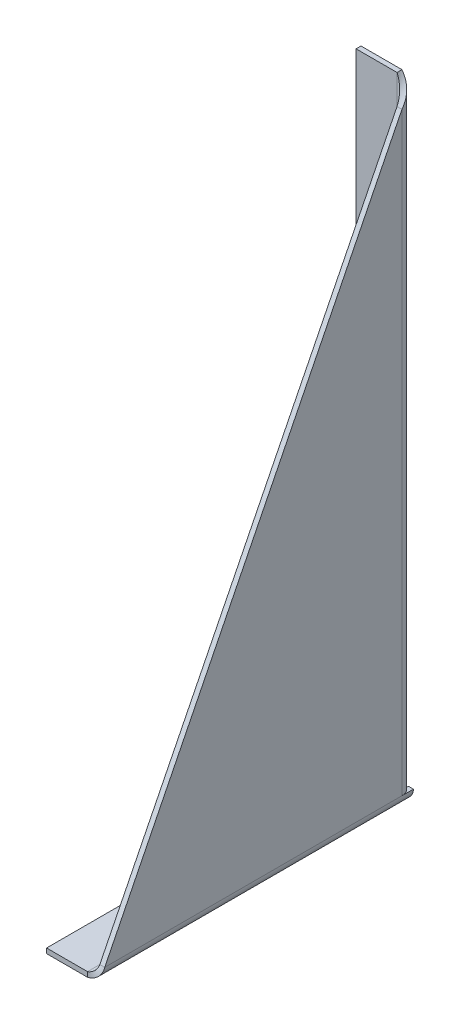
ISO-10303-21;
HEADER;
FILE_DESCRIPTION(('STEP AP214'),'2;1');
FILE_NAME('part.step','',(''),(''),'','','');
FILE_SCHEMA(('AUTOMOTIVE_DESIGN { 1 0 10303 214 1 1 1 1 }'));
ENDSEC;
DATA;
#1=APPLICATION_CONTEXT('core data for automotive mechanical design processes');
#2=APPLICATION_PROTOCOL_DEFINITION('international standard','automotive_design',2000,#1);
#3=PRODUCT_CONTEXT('',#1,'mechanical');
#4=PRODUCT('Part','Part','',(#3));
#5=PRODUCT_RELATED_PRODUCT_CATEGORY('part','',(#4));
#6=PRODUCT_DEFINITION_FORMATION('','',#4);
#7=PRODUCT_DEFINITION_CONTEXT('part definition',#1,'design');
#8=PRODUCT_DEFINITION('design','',#6,#7);
#9=PRODUCT_DEFINITION_SHAPE('','',#8);
#10=(LENGTH_UNIT() NAMED_UNIT(*) SI_UNIT(.MILLI.,.METRE.));
#11=(NAMED_UNIT(*) PLANE_ANGLE_UNIT() SI_UNIT($,.RADIAN.));
#12=(NAMED_UNIT(*) SI_UNIT($,.STERADIAN.) SOLID_ANGLE_UNIT());
#13=UNCERTAINTY_MEASURE_WITH_UNIT(LENGTH_MEASURE(1.E-05),#10,'distance_accuracy_value','');
#14=(GEOMETRIC_REPRESENTATION_CONTEXT(3) GLOBAL_UNCERTAINTY_ASSIGNED_CONTEXT((#13)) GLOBAL_UNIT_ASSIGNED_CONTEXT((#10,
#11,#12)) REPRESENTATION_CONTEXT('',''));
#15=CARTESIAN_POINT('',(0.,0.,0.));
#16=DIRECTION('',(0.,0.,1.));
#17=DIRECTION('',(1.,0.,0.));
#18=AXIS2_PLACEMENT_3D('',#15,#16,#17);
#19=CARTESIAN_POINT('',(-2.38125,5.55624999999999,0.));
#20=DIRECTION('',(0.,1.,0.));
#21=DIRECTION('',(0.,0.,1.));
#22=AXIS2_PLACEMENT_3D('',#19,#20,#21);
#23=PLANE('',#22);
#24=DIRECTION('',(0.,0.,1.));
#25=VECTOR('',#24,1.);
#26=CARTESIAN_POINT('',(-2.38125,5.55624999999999,0.));
#27=LINE('',#26,#25);
#28=CARTESIAN_POINT('',(-2.38125,5.55624999999999,0.));
#29=VERTEX_POINT('',#28);
#30=CARTESIAN_POINT('',(-2.38125,5.55624999999999,0.996503399310422));
#31=VERTEX_POINT('',#30);
#32=EDGE_CURVE('E582',#29,#31,#27,.T.);
#33=ORIENTED_EDGE('',*,*,#32,.T.);
#34=CARTESIAN_POINT('',(-5.55624999999999,5.55624999999999,5.55624999999999));
#35=DIRECTION('',(0.,-1.,0.));
#36=DIRECTION('',(0.,0.,-1.));
#37=AXIS2_PLACEMENT_3D('',#34,#35,#36);
#38=CIRCLE('',#37,5.55625);
#39=CARTESIAN_POINT('',(0.,5.55624999999999,5.55624999999998));
#40=VERTEX_POINT('',#39);
#41=EDGE_CURVE('E13',#31,#40,#38,.T.);
#42=ORIENTED_EDGE('',*,*,#41,.T.);
#43=DIRECTION('',(0.,0.,1.));
#44=VECTOR('',#43,1.);
#45=CARTESIAN_POINT('',(0.,5.55624999999994,152.4));
#46=LINE('',#45,#44);
#47=CARTESIAN_POINT('',(0.,5.55624999999999,0.));
#48=VERTEX_POINT('',#47);
#49=EDGE_CURVE('E556',#48,#40,#46,.T.);
#50=ORIENTED_EDGE('',*,*,#49,.F.);
#51=DIRECTION('',(1.,0.,0.));
#52=VECTOR('',#51,1.);
#53=CARTESIAN_POINT('',(-2.38125,5.55624999999999,0.));
#54=LINE('',#53,#52);
#55=EDGE_CURVE('E125',#29,#48,#54,.T.);
#56=ORIENTED_EDGE('',*,*,#55,.F.);
#57=EDGE_LOOP('',(#33,#42,#50,#56));
#58=FACE_BOUND('',#57,.T.);
#59=ADVANCED_FACE('F77',(#58),#23,.T.);
#60=CARTESIAN_POINT('',(-2.38125,304.8,0.));
#61=DIRECTION('',(0.,0.447213595499958,0.894427190999916));
#62=DIRECTION('',(0.,-0.894427190999916,0.447213595499958));
#63=AXIS2_PLACEMENT_3D('',#60,#61,#62);
#64=PLANE('',#63);
#65=DIRECTION('',(0.,-0.894427190999916,0.447213595499958));
#66=VECTOR('',#65,1.);
#67=CARTESIAN_POINT('',(0.,304.8,0.));
#68=LINE('',#67,#66);
#69=CARTESIAN_POINT('',(0.,293.6875,5.55624999999999));
#70=VERTEX_POINT('',#69);
#71=CARTESIAN_POINT('',(0.,5.55624999999999,149.621875));
#72=VERTEX_POINT('',#71);
#73=EDGE_CURVE('E81',#70,#72,#68,.T.);
#74=ORIENTED_EDGE('',*,*,#73,.F.);
#75=DIRECTION('',(1.,0.,0.));
#76=VECTOR('',#75,1.);
#77=CARTESIAN_POINT('',(-2.38124999999999,293.6875,5.55624999999999));
#78=LINE('',#77,#76);
#79=CARTESIAN_POINT('',(-2.38124999999999,293.6875,5.55624999999999));
#80=VERTEX_POINT('',#79);
#81=EDGE_CURVE('E231',#80,#70,#78,.T.);
#82=ORIENTED_EDGE('',*,*,#81,.F.);
#83=DIRECTION('',(0.,-0.894427190999916,0.447213595499958));
#84=VECTOR('',#83,1.);
#85=CARTESIAN_POINT('',(-2.38125,304.8,0.));
#86=LINE('',#85,#84);
#87=CARTESIAN_POINT('',(-2.38125,5.55624999999999,149.621875));
#88=VERTEX_POINT('',#87);
#89=EDGE_CURVE('E86',#80,#88,#86,.T.);
#90=ORIENTED_EDGE('',*,*,#89,.T.);
#91=DIRECTION('',(1.,0.,0.));
#92=VECTOR('',#91,1.);
#93=CARTESIAN_POINT('',(-2.38125,5.55624999999999,149.621875));
#94=LINE('',#93,#92);
#95=EDGE_CURVE('E314',#88,#72,#94,.T.);
#96=ORIENTED_EDGE('',*,*,#95,.T.);
#97=EDGE_LOOP('',(#74,#82,#90,#96));
#98=FACE_BOUND('',#97,.T.);
#99=ADVANCED_FACE('F79',(#98),#64,.T.);
#100=CARTESIAN_POINT('',(-2.38125,0.,0.));
#101=DIRECTION('',(1.,0.,0.));
#102=DIRECTION('',(0.,0.,-1.));
#103=AXIS2_PLACEMENT_3D('',#100,#101,#102);
#104=PLANE('',#103);
#105=DIRECTION('',(0.,-1.,0.));
#106=VECTOR('',#105,1.);
#107=CARTESIAN_POINT('',(-2.38124999999999,5.55625000000004,5.55624999999999));
#108=LINE('',#107,#106);
#109=CARTESIAN_POINT('',(-2.38124999999999,5.55624999999999,5.55624999999999));
#110=VERTEX_POINT('',#109);
#111=EDGE_CURVE('E226',#110,#80,#108,.F.);
#112=ORIENTED_EDGE('',*,*,#111,.F.);
#113=DIRECTION('',(0.,0.,1.));
#114=VECTOR('',#113,1.);
#115=CARTESIAN_POINT('',(-2.38125,5.55624999999999,152.4));
#116=LINE('',#115,#114);
#117=EDGE_CURVE('E352',#88,#110,#116,.F.);
#118=ORIENTED_EDGE('',*,*,#117,.F.);
#119=ORIENTED_EDGE('',*,*,#89,.F.);
#120=EDGE_LOOP('',(#112,#118,#119));
#121=FACE_BOUND('',#120,.T.);
#122=ADVANCED_FACE('F272',(#121),#104,.F.);
#123=CARTESIAN_POINT('',(0.,0.,0.));
#124=DIRECTION('',(1.,0.,0.));
#125=DIRECTION('',(0.,0.,-1.));
#126=AXIS2_PLACEMENT_3D('',#123,#124,#125);
#127=PLANE('',#126);
#128=DIRECTION('',(0.,0.,1.));
#129=VECTOR('',#128,1.);
#130=CARTESIAN_POINT('',(0.,5.55624999999999,152.4));
#131=LINE('',#130,#129);
#132=EDGE_CURVE('E312',#72,#40,#131,.F.);
#133=ORIENTED_EDGE('',*,*,#132,.T.);
#134=DIRECTION('',(0.,-1.,0.));
#135=VECTOR('',#134,1.);
#136=CARTESIAN_POINT('',(0.,5.55625000000004,5.55624999999999));
#137=LINE('',#136,#135);
#138=EDGE_CURVE('E221',#40,#70,#137,.F.);
#139=ORIENTED_EDGE('',*,*,#138,.T.);
#140=ORIENTED_EDGE('',*,*,#73,.T.);
#141=EDGE_LOOP('',(#133,#139,#140));
#142=FACE_BOUND('',#141,.T.);
#143=ADVANCED_FACE('F334',(#142),#127,.T.);
#144=CARTESIAN_POINT('',(-5.55625,5.55624999999999,0.));
#145=DIRECTION('',(0.,0.,-1.));
#146=DIRECTION('',(-1.,0.,0.));
#147=AXIS2_PLACEMENT_3D('',#144,#145,#146);
#148=PLANE('',#147);
#149=DIRECTION('',(0.,1.,0.));
#150=VECTOR('',#149,1.);
#151=CARTESIAN_POINT('',(-5.55624999999998,0.,0.));
#152=LINE('',#151,#150);
#153=CARTESIAN_POINT('',(-5.55624999999999,2.38124999999999,0.));
#154=VERTEX_POINT('',#153);
#155=CARTESIAN_POINT('',(-5.55624999999998,0.,0.));
#156=VERTEX_POINT('',#155);
#157=EDGE_CURVE('E553',#154,#156,#152,.F.);
#158=ORIENTED_EDGE('',*,*,#157,.F.);
#159=CARTESIAN_POINT('',(-5.55625,5.55624999999999,0.));
#160=DIRECTION('',(0.,0.,1.));
#161=DIRECTION('',(1.,0.,0.));
#162=AXIS2_PLACEMENT_3D('',#159,#160,#161);
#163=CIRCLE('',#162,3.175);
#164=EDGE_CURVE('E313',#29,#154,#163,.F.);
#165=ORIENTED_EDGE('',*,*,#164,.F.);
#166=ORIENTED_EDGE('',*,*,#55,.T.);
#167=CARTESIAN_POINT('',(-5.55625,5.55624999999999,0.));
#168=DIRECTION('',(0.,0.,1.));
#169=DIRECTION('',(1.,0.,0.));
#170=AXIS2_PLACEMENT_3D('',#167,#168,#169);
#171=CIRCLE('',#170,5.55625);
#172=EDGE_CURVE('E343',#48,#156,#171,.F.);
#173=ORIENTED_EDGE('',*,*,#172,.T.);
#174=EDGE_LOOP('',(#158,#165,#166,#173));
#175=FACE_BOUND('',#174,.T.);
#176=ADVANCED_FACE('F325',(#175),#148,.T.);
#177=CARTESIAN_POINT('',(-5.55624999999998,-0.0238125000000113,152.4));
#178=CARTESIAN_POINT('',(-4.82570183986023,-0.0238125000000087,152.16845162232));
#179=CARTESIAN_POINT('',(-4.09568044603243,0.121421590898501,151.936979166667));
#180=CARTESIAN_POINT('',(-2.7460246133441,0.680467341333964,151.473958333333));
#181=CARTESIAN_POINT('',(-2.12704089336997,1.0940590402405,151.242447916667));
#182=CARTESIAN_POINT('',(-1.0940590402405,2.12704089336997,150.779427083333));
#183=CARTESIAN_POINT('',(-0.680467341333966,2.7460246133441,150.547916666667));
#184=CARTESIAN_POINT('',(-0.121421590898507,4.09568044603244,150.084895833333));
#185=CARTESIAN_POINT('',(0.0238124999999992,4.82570183986026,149.85342337768));
#186=CARTESIAN_POINT('',(0.0238124999999991,5.55624999999999,149.621875));
#187=CARTESIAN_POINT('',(-5.55624999999998,0.,152.4));
#188=CARTESIAN_POINT('',(-4.82881950762639,0.,152.168451682766));
#189=CARTESIAN_POINT('',(-4.10191331752873,0.144614315261665,151.936979166667));
#190=CARTESIAN_POINT('',(-2.75801704031418,0.70127437970665,151.473958333333));
#191=CARTESIAN_POINT('',(-2.14167478713937,1.11310110692511,151.242447916667));
#192=CARTESIAN_POINT('',(-1.11310110692511,2.14167478713937,150.779427083333));
#193=CARTESIAN_POINT('',(-0.701274379706652,2.75801704031419,150.547916666667));
#194=CARTESIAN_POINT('',(-0.144614315261671,4.10191331752874,150.084895833333));
#195=CARTESIAN_POINT('',(0.,4.82881950762642,149.853423317234));
#196=CARTESIAN_POINT('',(0.,5.55624999999999,149.621875));
#197=CARTESIAN_POINT('',(-5.55624999999999,2.38124999999999,152.4));
#198=CARTESIAN_POINT('',(-5.14058628424239,2.38124999999999,152.168457727406));
#199=CARTESIAN_POINT('',(-4.72520046715928,2.46388675157809,151.936979166667));
#200=CARTESIAN_POINT('',(-3.95725973732239,2.78197821697522,151.473958333333));
#201=CARTESIAN_POINT('',(-3.60506416407964,3.01730777538577,151.242447916667));
#202=CARTESIAN_POINT('',(-3.01730777538578,3.60506416407964,150.779427083333));
#203=CARTESIAN_POINT('',(-2.78197821697523,3.95725973732239,150.547916666667));
#204=CARTESIAN_POINT('',(-2.4638867515781,4.72520046715928,150.084895833333));
#205=CARTESIAN_POINT('',(-2.38125,5.14058628424239,149.853417272594));
#206=CARTESIAN_POINT('',(-2.38125,5.55624999999999,149.621875));
#207=CARTESIAN_POINT('',(-5.55624999999999,2.40530062499999,152.4));
#208=CARTESIAN_POINT('',(-5.14373512868621,2.40530062499999,152.168457788457));
#209=CARTESIAN_POINT('',(-4.73149566737054,2.48731140318489,151.936979166667));
#210=CARTESIAN_POINT('',(-3.96937208856217,2.80299332573164,151.473958333333));
#211=CARTESIAN_POINT('',(-3.61984439678674,3.03654026273722,151.242447916667));
#212=CARTESIAN_POINT('',(-3.03654026273723,3.61984439678673,150.779427083333));
#213=CARTESIAN_POINT('',(-2.80299332573164,3.96937208856217,150.547916666667));
#214=CARTESIAN_POINT('',(-2.48731140318489,4.73149566737054,150.084895833333));
#215=CARTESIAN_POINT('',(-2.405300625,5.14373512868621,149.853417211543));
#216=CARTESIAN_POINT('',(-2.405300625,5.55624999999999,149.621875));
#217=B_SPLINE_SURFACE_WITH_KNOTS('',1,3,((#177,#178,#179,#180,#181,#182,#183,#184,#185,#186),
(#187,#188,#189,#190,#191,#192,#193,#194,#195,#196),(#197,#198,#199,#200,#201,#202,#203,#204,
#205,#206),(#207,#208,#209,#210,#211,#212,#213,#214,#215,#216)),.UNSPECIFIED.,.F.,.F.,.F.,(2,1,
1,2),(4,2,2,2,4),(-0.01,0.,1.,1.0101),(0.,0.25,0.5,0.75,1.),.UNSPECIFIED.);
#218=CARTESIAN_POINT('',(-5.55624999999999,2.38124999999999,152.4));
#219=CARTESIAN_POINT('',(-5.46666090109255,2.38124041505701,152.350093108591));
#220=CARTESIAN_POINT('',(-5.37707317596189,2.38504154666799,152.300187019629));
#221=CARTESIAN_POINT('',(-5.19854934759974,2.40019501803075,152.200383057935));
#222=CARTESIAN_POINT('',(-5.10961316039504,2.41154636672773,152.150485184984));
#223=CARTESIAN_POINT('',(-4.93300019826956,2.44173302703924,152.050681428032));
#224=CARTESIAN_POINT('',(-4.84532367256282,2.46056979902164,152.000775544369));
#225=CARTESIAN_POINT('',(-4.67187352948099,2.50558909566138,151.900957294849));
#226=CARTESIAN_POINT('',(-4.5861000867557,2.53177229153079,151.851044928818));
#227=CARTESIAN_POINT('',(-4.4051541669731,2.59549794133177,151.744179496098));
#228=CARTESIAN_POINT('',(-4.31036076808948,2.63412125508188,151.687225560889));
#229=CARTESIAN_POINT('',(-4.12490619430006,2.72034754794941,151.573295917417));
#230=CARTESIAN_POINT('',(-4.034246744803,2.76795423467264,151.516320209891));
#231=CARTESIAN_POINT('',(-3.85798574110667,2.87166926914977,151.402401399609));
#232=CARTESIAN_POINT('',(-3.77238168139095,2.92777335549043,151.34545829479));
#233=CARTESIAN_POINT('',(-3.60695658974449,3.04799582542632,151.231548569969));
#234=CARTESIAN_POINT('',(-3.52713758837848,3.11211700171843,151.174581948701));
#235=CARTESIAN_POINT('',(-3.37407081790601,3.24774971629631,151.060657022631));
#236=CARTESIAN_POINT('',(-3.30082199173982,3.31926006175794,151.00369871797));
#237=CARTESIAN_POINT('',(-3.16156399941344,3.46901287381441,150.889781868224));
#238=CARTESIAN_POINT('',(-3.09555483501599,3.5472553420484,150.832823323139));
#239=CARTESIAN_POINT('',(-2.97134380762172,3.70980603854188,150.718868198181));
#240=CARTESIAN_POINT('',(-2.9131478361482,3.79411877129527,150.661871621815));
#241=CARTESIAN_POINT('',(-2.80518666684653,3.96793669222064,150.54789498402));
#242=CARTESIAN_POINT('',(-2.75541854635122,4.05744006583254,150.490914923735));
#243=CARTESIAN_POINT('',(-2.66470191537867,4.24093214650852,150.376890774375));
#244=CARTESIAN_POINT('',(-2.62376320210969,4.33492569614883,150.319846684058));
#245=CARTESIAN_POINT('',(-2.55117146613664,4.5263928511216,150.205779208101));
#246=CARTESIAN_POINT('',(-2.51951492959808,4.62386512384344,150.148755822808));
#247=CARTESIAN_POINT('',(-2.46580460035651,4.82125384358962,150.03480573941));
#248=CARTESIAN_POINT('',(-2.44373579794904,4.92116620969384,149.977879030162));
#249=CARTESIAN_POINT('',(-2.40934502280359,5.12260952873571,149.864047509933));
#250=CARTESIAN_POINT('',(-2.39701731986159,5.22413949420387,149.807142705788));
#251=CARTESIAN_POINT('',(-2.38682250016021,5.36432870000405,149.728842927781));
#252=CARTESIAN_POINT('',(-2.38473176178235,5.40270865342091,149.707434552135));
#253=CARTESIAN_POINT('',(-2.38194646086697,5.47947422950968,149.664643117532));
#254=CARTESIAN_POINT('',(-2.38125026352045,5.51785979272543,149.643260058333));
#255=CARTESIAN_POINT('',(-2.38125,5.55624999999999,149.621875));
#256=B_SPLINE_CURVE_WITH_KNOTS('',3,(#218,#219,#220,#221,#222,#223,#224,#225,#226,#227,#228,
#229,#230,#231,#232,#233,#234,#235,#236,#237,#238,#239,#240,#241,#242,#243,#244,#245,#246,#247,
#248,#249,#250,#251,#252,#253,#254,#255),.UNSPECIFIED.,.F.,.F.,(4,2,2,2,2,2,2,2,2,2,2,2,2,2,2,2,
2,2,4),(0.,0.307582997442148,0.615125628963629,0.92272828996297,1.23035906448933,
1.58134663835237,1.93247938943538,2.28343662831411,2.63451646307504,2.98553971174556,
3.33656304588407,3.68784959944513,4.03901408089327,4.39056623615535,4.74198513650294,
5.09285188662854,5.44351208533431,5.57548514811854,5.70730340920833),.UNSPECIFIED.);
#257=CARTESIAN_POINT('',(-5.55624999999999,2.38124999999999,152.4));
#258=VERTEX_POINT('',#257);
#259=EDGE_CURVE('E316',#258,#88,#256,.T.);
#260=DIRECTION('',(0.,1.,0.));
#261=VECTOR('',#260,1.);
#262=CARTESIAN_POINT('',(-5.55624999999999,2.38124999999999,152.4));
#263=LINE('',#262,#261);
#264=CARTESIAN_POINT('',(-5.55624999999998,0.,152.4));
#265=VERTEX_POINT('',#264);
#266=EDGE_CURVE('E558',#258,#265,#263,.F.);
#267=CARTESIAN_POINT('',(-5.55624999999998,0.,152.4));
#268=CARTESIAN_POINT('',(-5.39222924973911,-2.03697111468316E-05,152.347788331812));
#269=CARTESIAN_POINT('',(-5.22821120137321,0.00726199032458196,152.295577783836));
#270=CARTESIAN_POINT('',(-4.90146692582221,0.036285149405175,152.191161704353));
#271=CARTESIAN_POINT('',(-4.73874063051544,0.0580251808177364,152.138956172727));
#272=CARTESIAN_POINT('',(-4.41597567927968,0.115793944747649,152.034588452675));
#273=CARTESIAN_POINT('',(-4.25593500851214,0.151811415917823,151.98242626248));
#274=CARTESIAN_POINT('',(-3.939665950031,0.237845853161354,151.878097821083));
#275=CARTESIAN_POINT('',(-3.78343751209572,0.287862634701883,151.825931569943));
#276=CARTESIAN_POINT('',(-3.47592287348703,0.4015393914794,151.721569503876));
#277=CARTESIAN_POINT('',(-3.32463957606517,0.465207221040563,151.669373689256));
#278=CARTESIAN_POINT('',(-3.02824038249729,0.605695629367385,151.564962647053));
#279=CARTESIAN_POINT('',(-2.88312677774738,0.682521042446689,151.512747419398));
#280=CARTESIAN_POINT('',(-2.60032456674858,0.848670722788835,151.408344538769));
#281=CARTESIAN_POINT('',(-2.46263273318536,0.93798949564216,151.356156883741));
#282=CARTESIAN_POINT('',(-2.19568324034633,1.12845253403165,151.251777395514));
#283=CARTESIAN_POINT('',(-2.0664257589181,1.22959704880111,151.199585562248));
#284=CARTESIAN_POINT('',(-1.81736928125491,1.44291000961841,151.095203981869));
#285=CARTESIAN_POINT('',(-1.69756958924114,1.55507764336584,151.043014234884));
#286=CARTESIAN_POINT('',(-1.46835597691733,1.7895648001765,150.938634060507));
#287=CARTESIAN_POINT('',(-1.3589420570885,1.9118843237101,150.886443633115));
#288=CARTESIAN_POINT('',(-1.15131625866794,2.1657671164626,150.782046762958));
#289=CARTESIAN_POINT('',(-1.05310867893295,2.29733390195172,150.729840321699));
#290=CARTESIAN_POINT('',(-0.868716373510253,2.56863504006366,150.625429367484));
#291=CARTESIAN_POINT('',(-0.782531395322642,2.70836922106653,150.573224854511));
#292=CARTESIAN_POINT('',(-0.622809870449583,2.99499724678851,150.468779645361));
#293=CARTESIAN_POINT('',(-0.549280975572844,3.14189535439459,150.416538946333));
#294=CARTESIAN_POINT('',(-0.415535761944639,3.44156714760269,150.312077727971));
#295=CARTESIAN_POINT('',(-0.355314521441942,3.59433863634816,150.259857208331));
#296=CARTESIAN_POINT('',(-0.248665446951269,3.90448414901306,150.155459126881));
#297=CARTESIAN_POINT('',(-0.202226588463913,4.06185438310978,150.103281564211));
#298=CARTESIAN_POINT('',(-0.123455032418098,4.38002667914916,149.998949488509));
#299=CARTESIAN_POINT('',(-0.0911167157239651,4.54082734720159,149.946794974586));
#300=CARTESIAN_POINT('',(-0.0439887266945035,4.8439855129455,149.849140766533));
#301=CARTESIAN_POINT('',(-0.0274868539155354,4.98607941179266,149.803640739908));
#302=CARTESIAN_POINT('',(-0.0054969794958962,5.27086362238831,149.712719632739));
#303=CARTESIAN_POINT('',(1.04261535497424E-05,5.41355243721639,149.667298554718));
#304=CARTESIAN_POINT('',(0.,5.55624999999999,149.621875));
#305=B_SPLINE_CURVE_WITH_KNOTS('',3,(#267,#268,#269,#270,#271,#272,#273,#274,#275,#276,#277,
#278,#279,#280,#281,#282,#283,#284,#285,#286,#287,#288,#289,#290,#291,#292,#293,#294,#295,#296,
#297,#298,#299,#300,#301,#302,#303,#304),.UNSPECIFIED.,.F.,.F.,(4,2,2,2,2,2,2,2,2,2,2,2,2,2,2,2,
2,2,4),(0.,0.516233035731352,1.03243866417777,1.54823794241121,2.06403042192279,
2.58012047016457,3.09640054681476,3.6124542802638,4.12851889175858,4.64454550261058,
5.16057213737173,5.67679606398377,6.19300914717568,6.70953324239668,7.22586598355228,
7.74178459109643,8.25749741420172,8.70743200890214,9.15657181468087),.UNSPECIFIED.);
#306=EDGE_CURVE('E304',#265,#72,#305,.T.);
#307=ORIENTED_EDGE('',*,*,#259,.F.);
#308=ORIENTED_EDGE('',*,*,#266,.T.);
#309=ORIENTED_EDGE('',*,*,#306,.T.);
#310=ORIENTED_EDGE('',*,*,#95,.F.);
#311=EDGE_LOOP('',(#307,#308,#309,#310));
#312=FACE_BOUND('',#311,.T.);
#313=ADVANCED_FACE('F299',(#312),#217,.F.);
#314=CARTESIAN_POINT('',(-5.55625,5.55624999999999,152.4));
#315=DIRECTION('',(0.,0.,1.));
#316=DIRECTION('',(0.,-1.,0.));
#317=AXIS2_PLACEMENT_3D('',#314,#315,#316);
#318=CYLINDRICAL_SURFACE('',#317,5.55625);
#319=ORIENTED_EDGE('',*,*,#132,.F.);
#320=ORIENTED_EDGE('',*,*,#306,.F.);
#321=DIRECTION('',(0.,0.,1.));
#322=VECTOR('',#321,1.);
#323=CARTESIAN_POINT('',(-5.55624999999998,0.,0.));
#324=LINE('',#323,#322);
#325=EDGE_CURVE('E561',#265,#156,#324,.F.);
#326=ORIENTED_EDGE('',*,*,#325,.T.);
#327=ORIENTED_EDGE('',*,*,#172,.F.);
#328=ORIENTED_EDGE('',*,*,#49,.T.);
#329=EDGE_LOOP('',(#319,#320,#326,#327,#328));
#330=FACE_BOUND('',#329,.T.);
#331=ADVANCED_FACE('F295',(#330),#318,.T.);
#332=CARTESIAN_POINT('',(-5.55625,5.55624999999999,152.4));
#333=DIRECTION('',(0.,0.,1.));
#334=DIRECTION('',(0.,-1.,0.));
#335=AXIS2_PLACEMENT_3D('',#332,#333,#334);
#336=CYLINDRICAL_SURFACE('',#335,3.175);
#337=ORIENTED_EDGE('',*,*,#117,.T.);
#338=EDGE_CURVE('E95',#31,#110,#27,.T.);
#339=ORIENTED_EDGE('',*,*,#338,.F.);
#340=ORIENTED_EDGE('',*,*,#32,.F.);
#341=ORIENTED_EDGE('',*,*,#164,.T.);
#342=DIRECTION('',(0.,0.,1.));
#343=VECTOR('',#342,1.);
#344=CARTESIAN_POINT('',(-5.55624999999999,2.38124999999999,0.));
#345=LINE('',#344,#343);
#346=EDGE_CURVE('E555',#154,#258,#345,.T.);
#347=ORIENTED_EDGE('',*,*,#346,.T.);
#348=ORIENTED_EDGE('',*,*,#259,.T.);
#349=EDGE_LOOP('',(#337,#339,#340,#341,#347,#348));
#350=FACE_BOUND('',#349,.T.);
#351=ADVANCED_FACE('F293',(#350),#336,.F.);
#352=CARTESIAN_POINT('',(-25.4,0.,152.4));
#353=DIRECTION('',(0.,0.,-1.));
#354=DIRECTION('',(-1.,0.,0.));
#355=AXIS2_PLACEMENT_3D('',#352,#353,#354);
#356=PLANE('',#355);
#357=ORIENTED_EDGE('',*,*,#266,.F.);
#358=DIRECTION('',(1.,0.,0.));
#359=VECTOR('',#358,1.);
#360=CARTESIAN_POINT('',(-25.4,2.38124999999992,152.4));
#361=LINE('',#360,#359);
#362=CARTESIAN_POINT('',(-25.4,2.38124999999992,152.4));
#363=VERTEX_POINT('',#362);
#364=EDGE_CURVE('E563',#258,#363,#361,.F.);
#365=ORIENTED_EDGE('',*,*,#364,.T.);
#366=DIRECTION('',(0.,1.,0.));
#367=VECTOR('',#366,1.);
#368=CARTESIAN_POINT('',(-25.4,0.,152.4));
#369=LINE('',#368,#367);
#370=CARTESIAN_POINT('',(-25.4,0.,152.4));
#371=VERTEX_POINT('',#370);
#372=EDGE_CURVE('E545',#371,#363,#369,.T.);
#373=ORIENTED_EDGE('',*,*,#372,.F.);
#374=DIRECTION('',(-1.,0.,0.));
#375=VECTOR('',#374,1.);
#376=CARTESIAN_POINT('',(0.,0.,152.4));
#377=LINE('',#376,#375);
#378=EDGE_CURVE('E570',#265,#371,#377,.T.);
#379=ORIENTED_EDGE('',*,*,#378,.F.);
#380=EDGE_LOOP('',(#357,#365,#373,#379));
#381=FACE_BOUND('',#380,.T.);
#382=ADVANCED_FACE('F286',(#381),#356,.F.);
#383=CARTESIAN_POINT('',(-2.38124999999999,0.,0.));
#384=DIRECTION('',(0.,0.,1.));
#385=DIRECTION('',(1.,0.,0.));
#386=AXIS2_PLACEMENT_3D('',#383,#384,#385);
#387=PLANE('',#386);
#388=ORIENTED_EDGE('',*,*,#157,.T.);
#389=DIRECTION('',(1.,0.,0.));
#390=VECTOR('',#389,1.);
#391=CARTESIAN_POINT('',(0.,0.,0.));
#392=LINE('',#391,#390);
#393=CARTESIAN_POINT('',(-25.4,0.,0.));
#394=VERTEX_POINT('',#393);
#395=EDGE_CURVE('E574',#394,#156,#392,.T.);
#396=ORIENTED_EDGE('',*,*,#395,.F.);
#397=DIRECTION('',(0.,1.,0.));
#398=VECTOR('',#397,1.);
#399=CARTESIAN_POINT('',(-25.4,0.,0.));
#400=LINE('',#399,#398);
#401=CARTESIAN_POINT('',(-25.4,2.38124999999992,0.));
#402=VERTEX_POINT('',#401);
#403=EDGE_CURVE('E577',#394,#402,#400,.T.);
#404=ORIENTED_EDGE('',*,*,#403,.T.);
#405=DIRECTION('',(-1.,0.,0.));
#406=VECTOR('',#405,1.);
#407=CARTESIAN_POINT('',(-2.38125,2.38125,0.));
#408=LINE('',#407,#406);
#409=EDGE_CURVE('E567',#402,#154,#408,.F.);
#410=ORIENTED_EDGE('',*,*,#409,.T.);
#411=EDGE_LOOP('',(#388,#396,#404,#410));
#412=FACE_BOUND('',#411,.T.);
#413=ADVANCED_FACE('F278',(#412),#387,.F.);
#414=CARTESIAN_POINT('',(0.,0.,0.));
#415=DIRECTION('',(0.,1.,0.));
#416=DIRECTION('',(-1.,0.,0.));
#417=AXIS2_PLACEMENT_3D('',#414,#415,#416);
#418=PLANE('',#417);
#419=ORIENTED_EDGE('',*,*,#325,.F.);
#420=ORIENTED_EDGE('',*,*,#378,.T.);
#421=DIRECTION('',(0.,0.,-1.));
#422=VECTOR('',#421,1.);
#423=CARTESIAN_POINT('',(-25.4,0.,0.));
#424=LINE('',#423,#422);
#425=EDGE_CURVE('E572',#371,#394,#424,.T.);
#426=ORIENTED_EDGE('',*,*,#425,.T.);
#427=ORIENTED_EDGE('',*,*,#395,.T.);
#428=EDGE_LOOP('',(#419,#420,#426,#427));
#429=FACE_BOUND('',#428,.T.);
#430=ADVANCED_FACE('F274',(#429),#418,.F.);
#431=CARTESIAN_POINT('',(0.,2.38125000000001,0.));
#432=DIRECTION('',(0.,1.,0.));
#433=DIRECTION('',(-1.,0.,0.));
#434=AXIS2_PLACEMENT_3D('',#431,#432,#433);
#435=PLANE('',#434);
#436=ORIENTED_EDGE('',*,*,#364,.F.);
#437=ORIENTED_EDGE('',*,*,#346,.F.);
#438=ORIENTED_EDGE('',*,*,#409,.F.);
#439=DIRECTION('',(0.,0.,1.));
#440=VECTOR('',#439,1.);
#441=CARTESIAN_POINT('',(-25.4,2.38124999999992,0.));
#442=LINE('',#441,#440);
#443=EDGE_CURVE('E565',#363,#402,#442,.F.);
#444=ORIENTED_EDGE('',*,*,#443,.F.);
#445=EDGE_LOOP('',(#436,#437,#438,#444));
#446=FACE_BOUND('',#445,.T.);
#447=ADVANCED_FACE('F277',(#446),#435,.T.);
#448=CARTESIAN_POINT('',(-25.4,0.,0.));
#449=DIRECTION('',(1.,0.,0.));
#450=DIRECTION('',(0.,1.,0.));
#451=AXIS2_PLACEMENT_3D('',#448,#449,#450);
#452=PLANE('',#451);
#453=ORIENTED_EDGE('',*,*,#443,.T.);
#454=ORIENTED_EDGE('',*,*,#403,.F.);
#455=ORIENTED_EDGE('',*,*,#425,.F.);
#456=ORIENTED_EDGE('',*,*,#372,.T.);
#457=EDGE_LOOP('',(#453,#454,#455,#456));
#458=FACE_BOUND('',#457,.T.);
#459=ADVANCED_FACE('F282',(#458),#452,.F.);
#460=CARTESIAN_POINT('',(0.02381250000001,293.6875,5.55624999999999));
#461=CARTESIAN_POINT('',(0.0238124999999855,294.613605722302,4.82577112341176));
#462=CARTESIAN_POINT('',(-0.121421590898474,295.539583333333,4.09568044603242));
#463=CARTESIAN_POINT('',(-0.680467341333981,297.391666666667,2.74602461334411));
#464=CARTESIAN_POINT('',(-1.09405904024049,298.317708333333,2.12704089336997));
#465=CARTESIAN_POINT('',(-2.12704089336997,300.169791666667,1.09405904024049));
#466=CARTESIAN_POINT('',(-2.7460246133441,301.095833333333,0.680467341333957));
#467=CARTESIAN_POINT('',(-4.09568044603244,302.947916666667,0.121421590898496));
#468=CARTESIAN_POINT('',(-4.82577112341191,303.873894277699,-0.0238125000000358));
#469=CARTESIAN_POINT('',(-5.55624999999999,304.8,-0.0238125000000113));
#470=CARTESIAN_POINT('',(0.,293.6875,5.55624999999999));
#471=CARTESIAN_POINT('',(0.,294.613605365232,4.82888854703392));
#472=CARTESIAN_POINT('',(-0.144614315261639,295.539583333333,4.10191331752873));
#473=CARTESIAN_POINT('',(-0.701274379706667,297.391666666667,2.75801704031419));
#474=CARTESIAN_POINT('',(-1.1131011069251,298.317708333333,2.14167478713937));
#475=CARTESIAN_POINT('',(-2.14167478713937,300.169791666667,1.1131011069251));
#476=CARTESIAN_POINT('',(-2.75801704031418,301.095833333333,0.701274379706643));
#477=CARTESIAN_POINT('',(-4.10191331752874,302.947916666667,0.14461431526166));
#478=CARTESIAN_POINT('',(-4.82888854703408,303.873894634768,0.));
#479=CARTESIAN_POINT('',(-5.55624999999999,304.8,0.));
#480=CARTESIAN_POINT('',(-2.38124999999999,293.6875,5.55624999999999));
#481=CARTESIAN_POINT('',(-2.38124999999999,294.613569658305,5.14063090925085));
#482=CARTESIAN_POINT('',(-2.46388675157809,295.539583333333,4.72520046715927));
#483=CARTESIAN_POINT('',(-2.78197821697522,297.391666666667,3.95725973732238));
#484=CARTESIAN_POINT('',(-3.01730777538577,298.317708333333,3.60506416407963));
#485=CARTESIAN_POINT('',(-3.60506416407964,300.169791666667,3.01730777538577));
#486=CARTESIAN_POINT('',(-3.95725973732239,301.095833333333,2.78197821697522));
#487=CARTESIAN_POINT('',(-4.72520046715928,302.947916666667,2.46388675157809));
#488=CARTESIAN_POINT('',(-5.1406309092508,303.873930341695,2.38124999999999));
#489=CARTESIAN_POINT('',(-5.55624999999999,304.8,2.38124999999999));
#490=CARTESIAN_POINT('',(-2.40530062499999,293.6875,5.55624999999999));
#491=CARTESIAN_POINT('',(-2.40530062499999,294.613569297665,5.14377950710924));
#492=CARTESIAN_POINT('',(-2.48731140318488,295.539583333333,4.73149566737054));
#493=CARTESIAN_POINT('',(-2.80299332573163,297.391666666667,3.96937208856217));
#494=CARTESIAN_POINT('',(-3.03654026273722,298.317708333333,3.61984439678673));
#495=CARTESIAN_POINT('',(-3.61984439678673,300.169791666667,3.03654026273722));
#496=CARTESIAN_POINT('',(-3.96937208856217,301.095833333333,2.80299332573163));
#497=CARTESIAN_POINT('',(-4.73149566737054,302.947916666667,2.48731140318488));
#498=CARTESIAN_POINT('',(-5.14377950710919,303.873930702335,2.40530062499999));
#499=CARTESIAN_POINT('',(-5.55624999999999,304.8,2.40530062499999));
#500=B_SPLINE_SURFACE_WITH_KNOTS('',1,3,((#460,#461,#462,#463,#464,#465,#466,#467,#468,#469),
(#470,#471,#472,#473,#474,#475,#476,#477,#478,#479),(#480,#481,#482,#483,#484,#485,#486,#487,
#488,#489),(#490,#491,#492,#493,#494,#495,#496,#497,#498,#499)),.UNSPECIFIED.,.F.,.F.,.F.,(2,1,
1,2),(4,2,2,2,4),(-0.01,0.,1.,1.0101),(0.,0.25,0.5,0.75,1.),.UNSPECIFIED.);
#501=DIRECTION('',(0.,0.,1.));
#502=VECTOR('',#501,1.);
#503=CARTESIAN_POINT('',(-5.55624999999999,304.8,0.));
#504=LINE('',#503,#502);
#505=CARTESIAN_POINT('',(-5.55624999999998,304.8,2.38124999999999));
#506=VERTEX_POINT('',#505);
#507=CARTESIAN_POINT('',(-5.55624999999997,304.8,0.));
#508=VERTEX_POINT('',#507);
#509=EDGE_CURVE('E202',#506,#508,#504,.F.);
#510=CARTESIAN_POINT('',(-2.38124999999999,293.6875,5.55624999999999));
#511=CARTESIAN_POINT('',(-2.38122588634438,293.936485489152,5.44451262071661));
#512=CARTESIAN_POINT('',(-2.38714744260747,294.185467930249,5.33277276854961));
#513=CARTESIAN_POINT('',(-2.41071350471048,294.68344451847,5.11052350336438));
#514=CARTESIAN_POINT('',(-2.4283586778014,294.932438665453,5.00001416074477));
#515=CARTESIAN_POINT('',(-2.47520455722122,295.43043885691,4.78146959236254));
#516=CARTESIAN_POINT('',(-2.50440576162254,295.679444901434,4.67343447345292));
#517=CARTESIAN_POINT('',(-2.57392255373735,296.176701110977,4.46137186657693));
#518=CARTESIAN_POINT('',(-2.61420403156935,296.424951269141,4.35733317831565));
#519=CARTESIAN_POINT('',(-2.705471243692,296.921426057803,4.15407441495574));
#520=CARTESIAN_POINT('',(-2.75645588310356,297.169650688316,4.05485384826505));
#521=CARTESIAN_POINT('',(-2.86856441306638,297.666052995292,3.86232668398613));
#522=CARTESIAN_POINT('',(-2.92968655698075,297.914230672482,3.76901907144898));
#523=CARTESIAN_POINT('',(-3.05966026560586,298.404073901839,3.59170668518128));
#524=CARTESIAN_POINT('',(-3.12826683295601,298.645739397433,3.50752201351877));
#525=CARTESIAN_POINT('',(-3.27372481624046,299.129051483206,3.34662019535754));
#526=CARTESIAN_POINT('',(-3.35057554236978,299.370698073276,3.2699024251114));
#527=CARTESIAN_POINT('',(-3.51171195115318,299.853958767949,3.12473856366687));
#528=CARTESIAN_POINT('',(-3.59599667925985,300.095572872745,3.05629141316403));
#529=CARTESIAN_POINT('',(-3.77113835282202,300.578813510788,2.9283687631965));
#530=CARTESIAN_POINT('',(-3.86199567427666,300.820440043954,2.86889377760499));
#531=CARTESIAN_POINT('',(-4.03604989756914,301.269493621299,2.76729202152363));
#532=CARTESIAN_POINT('',(-4.11851116244894,301.476921194196,2.72390128968466));
#533=CARTESIAN_POINT('',(-4.28693389461816,301.891793421081,2.64452754642759));
#534=CARTESIAN_POINT('',(-4.37289562447835,302.099238075181,2.60854509193678));
#535=CARTESIAN_POINT('',(-4.54765073791967,302.514136774128,2.54427041551981));
#536=CARTESIAN_POINT('',(-4.63644424992481,302.721590818973,2.51597854292455));
#537=CARTESIAN_POINT('',(-4.81636995106641,303.136930904938,2.4672520806352));
#538=CARTESIAN_POINT('',(-4.90750665682577,303.344816939052,2.44683410375076));
#539=CARTESIAN_POINT('',(-5.09121883740899,303.760586967551,2.41410558297761));
#540=CARTESIAN_POINT('',(-5.18379428709648,303.968470961908,2.40179489760866));
#541=CARTESIAN_POINT('',(-5.36966323501057,304.384236350133,2.38536151432226));
#542=CARTESIAN_POINT('',(-5.46295671849509,304.592117743966,2.38123864874697));
#543=CARTESIAN_POINT('',(-5.55624999999999,304.8,2.38124999999999));
#544=B_SPLINE_CURVE_WITH_KNOTS('',3,(#510,#511,#512,#513,#514,#515,#516,#517,#518,#519,#520,
#521,#522,#523,#524,#525,#526,#527,#528,#529,#530,#531,#532,#533,#534,#535,#536,#537,#538,#539,
#540,#541,#542,#543),.UNSPECIFIED.,.F.,.F.,(4,2,2,2,2,2,2,2,2,2,2,2,2,2,2,2,4),(0.,
0.818658594069948,1.63736378617982,2.45610426885698,3.27235198910989,4.08851625201572,
4.90454004005831,5.69914446539222,6.49368245639253,7.2881185745196,8.08260017604359,
8.76464422232833,9.44673952349197,10.1288658024377,10.8124234987935,11.495969266077,
12.1795010365946),.UNSPECIFIED.);
#545=EDGE_CURVE('E222',#80,#506,#544,.T.);
#546=CARTESIAN_POINT('',(0.,293.6875,5.55624999999999));
#547=CARTESIAN_POINT('',(2.25104413151933E-05,293.901710761514,5.38801702776936));
#548=CARTESIAN_POINT('',(-0.00763976498536387,294.115919012786,5.21978438033771));
#549=CARTESIAN_POINT('',(-0.0381715376610822,294.544306396486,4.88471882307786));
#550=CARTESIAN_POINT('',(-0.0610392565416509,294.75848552939,4.71788575187108));
#551=CARTESIAN_POINT('',(-0.121818409868782,295.186832032184,4.38698512189652));
#552=CARTESIAN_POINT('',(-0.159729237195736,295.4009994022,4.22291745179942));
#553=CARTESIAN_POINT('',(-0.250119288477214,295.82862788277,3.89944743369873));
#554=CARTESIAN_POINT('',(-0.302549494849307,296.042088966179,3.74003134915544));
#555=CARTESIAN_POINT('',(-0.4216044439231,296.469003271885,3.42659455728689));
#556=CARTESIAN_POINT('',(-0.488228740865229,296.68245649422,3.27257368070417));
#557=CARTESIAN_POINT('',(-0.635125542571759,297.109357197181,2.97118684143832));
#558=CARTESIAN_POINT('',(-0.715397748055759,297.32280467783,2.82382073291468));
#559=CARTESIAN_POINT('',(-0.889101407125203,297.750090298736,2.53667298444088));
#560=CARTESIAN_POINT('',(-0.982557098904968,297.963928425928,2.39690598653863));
#561=CARTESIAN_POINT('',(-1.1817403345546,298.391620854371,2.12641143302215));
#562=CARTESIAN_POINT('',(-1.28746839066279,298.605475155923,1.9956842550862));
#563=CARTESIAN_POINT('',(-1.51033101393178,299.033190609056,1.74433920994075));
#564=CARTESIAN_POINT('',(-1.62746589921471,299.247051760662,1.62372162484974));
#565=CARTESIAN_POINT('',(-1.8721420339197,299.674714975446,1.39362361258057));
#566=CARTESIAN_POINT('',(-1.99968032908992,299.888517038218,1.28414004338471));
#567=CARTESIAN_POINT('',(-2.26414973371459,300.316105329568,1.07716710412719));
#568=CARTESIAN_POINT('',(-2.40108054980553,300.529891558431,0.979677359719061));
#569=CARTESIAN_POINT('',(-2.68319098057675,300.957446870288,0.797507017942539));
#570=CARTESIAN_POINT('',(-2.82836971654504,301.171215952687,0.712825059573057));
#571=CARTESIAN_POINT('',(-3.10890114787437,301.574484202317,0.565803796746734));
#572=CARTESIAN_POINT('',(-3.24349856325901,301.763983856393,0.502019453862469));
#573=CARTESIAN_POINT('',(-3.51737296401567,302.14297152075,0.385462898929149));
#574=CARTESIAN_POINT('',(-3.65664963639969,302.332459530962,0.332689952041359));
#575=CARTESIAN_POINT('',(-3.93898804057284,302.711429371977,0.238494397108155));
#576=CARTESIAN_POINT('',(-4.082049693525,302.900911202827,0.197071552856362));
#577=CARTESIAN_POINT('',(-4.37139271842424,303.280328271312,0.125754256923533));
#578=CARTESIAN_POINT('',(-4.51768104245126,303.470263496843,0.0958879381241024));
#579=CARTESIAN_POINT('',(-4.81219011830922,303.850150110659,0.0480255225649848));
#580=CARTESIAN_POINT('',(-4.96041098938284,304.040101499217,0.0300301618395951));
#581=CARTESIAN_POINT('',(-5.25783745608563,304.42003502806,0.00600964459308251));
#582=CARTESIAN_POINT('',(-5.40704319299076,304.610017168769,-1.37554263843905E-05));
#583=CARTESIAN_POINT('',(-5.55624999999999,304.8,0.));
#584=B_SPLINE_CURVE_WITH_KNOTS('',3,(#546,#547,#548,#549,#550,#551,#552,#553,#554,#555,#556,
#557,#558,#559,#560,#561,#562,#563,#564,#565,#566,#567,#568,#569,#570,#571,#572,#573,#574,#575,
#576,#577,#578,#579,#580,#581,#582,#583),.UNSPECIFIED.,.F.,.F.,(4,2,2,2,2,2,2,2,2,2,2,2,2,2,2,2,
2,2,4),(0.,0.817016618055534,1.63393769788528,2.45082581123264,3.26498903354446,
4.07912669116332,4.89324649813302,5.70888308129334,6.52455372069959,7.34024711465348,
8.15570967753549,8.97114678206411,9.78649717436112,10.5092944823873,11.2320435395421,
11.9547775544622,12.6792600670313,13.4037874954248,14.1284212171603),.UNSPECIFIED.);
#585=EDGE_CURVE('E230',#70,#508,#584,.T.);
#586=ORIENTED_EDGE('',*,*,#509,.F.);
#587=ORIENTED_EDGE('',*,*,#545,.F.);
#588=ORIENTED_EDGE('',*,*,#81,.T.);
#589=ORIENTED_EDGE('',*,*,#585,.T.);
#590=EDGE_LOOP('',(#586,#587,#588,#589));
#591=FACE_BOUND('',#590,.T.);
#592=ADVANCED_FACE('F246',(#591),#500,.F.);
#593=CARTESIAN_POINT('',(-5.55624999999999,5.55624999999999,5.55624999999999));
#594=DIRECTION('',(0.,1.,0.));
#595=DIRECTION('',(0.,0.,1.));
#596=AXIS2_PLACEMENT_3D('',#593,#594,#595);
#597=PLANE('',#596);
#598=CARTESIAN_POINT('',(-5.55624999999999,5.55624999999999,0.));
#599=VERTEX_POINT('',#598);
#600=EDGE_CURVE('E88',#599,#31,#38,.T.);
#601=ORIENTED_EDGE('',*,*,#600,.T.);
#602=ORIENTED_EDGE('',*,*,#338,.T.);
#603=CARTESIAN_POINT('',(-5.55624999999999,5.55624999999999,5.55624999999999));
#604=DIRECTION('',(0.,-1.,0.));
#605=DIRECTION('',(0.,0.,-1.));
#606=AXIS2_PLACEMENT_3D('',#603,#604,#605);
#607=CIRCLE('',#606,3.175);
#608=CARTESIAN_POINT('',(-5.55624999999998,5.55624999999999,2.38124999999999));
#609=VERTEX_POINT('',#608);
#610=EDGE_CURVE('E223',#609,#110,#607,.T.);
#611=ORIENTED_EDGE('',*,*,#610,.F.);
#612=DIRECTION('',(0.,0.,1.));
#613=VECTOR('',#612,1.);
#614=CARTESIAN_POINT('',(-5.55624999999999,5.55624999999998,2.38124999999999));
#615=LINE('',#614,#613);
#616=EDGE_CURVE('E214',#609,#599,#615,.F.);
#617=ORIENTED_EDGE('',*,*,#616,.T.);
#618=EDGE_LOOP('',(#601,#602,#611,#617));
#619=FACE_BOUND('',#618,.T.);
#620=ADVANCED_FACE('F256',(#619),#597,.F.);
#621=CARTESIAN_POINT('',(-5.55624999999999,5.55625000000004,5.55624999999999));
#622=DIRECTION('',(0.,-1.,0.));
#623=DIRECTION('',(0.,0.,-1.));
#624=AXIS2_PLACEMENT_3D('',#621,#622,#623);
#625=CYLINDRICAL_SURFACE('',#624,5.55625);
#626=ORIENTED_EDGE('',*,*,#138,.F.);
#627=ORIENTED_EDGE('',*,*,#41,.F.);
#628=ORIENTED_EDGE('',*,*,#600,.F.);
#629=DIRECTION('',(0.,-1.,0.));
#630=VECTOR('',#629,1.);
#631=CARTESIAN_POINT('',(-5.55624999999999,304.8,0.));
#632=LINE('',#631,#630);
#633=EDGE_CURVE('E212',#599,#508,#632,.F.);
#634=ORIENTED_EDGE('',*,*,#633,.T.);
#635=ORIENTED_EDGE('',*,*,#585,.F.);
#636=EDGE_LOOP('',(#626,#627,#628,#634,#635));
#637=FACE_BOUND('',#636,.T.);
#638=ADVANCED_FACE('F251',(#637),#625,.T.);
#639=CARTESIAN_POINT('',(-5.55624999999999,5.55625000000004,5.55624999999999));
#640=DIRECTION('',(0.,-1.,0.));
#641=DIRECTION('',(0.,0.,-1.));
#642=AXIS2_PLACEMENT_3D('',#639,#640,#641);
#643=CYLINDRICAL_SURFACE('',#642,3.175);
#644=ORIENTED_EDGE('',*,*,#111,.T.);
#645=ORIENTED_EDGE('',*,*,#545,.T.);
#646=DIRECTION('',(0.,-1.,0.));
#647=VECTOR('',#646,1.);
#648=CARTESIAN_POINT('',(-5.55624999999999,304.8,2.38124999999999));
#649=LINE('',#648,#647);
#650=EDGE_CURVE('E217',#506,#609,#649,.T.);
#651=ORIENTED_EDGE('',*,*,#650,.T.);
#652=ORIENTED_EDGE('',*,*,#610,.T.);
#653=EDGE_LOOP('',(#644,#645,#651,#652));
#654=FACE_BOUND('',#653,.T.);
#655=ADVANCED_FACE('F255',(#654),#643,.F.);
#656=CARTESIAN_POINT('',(-25.4,5.55624999999999,0.));
#657=DIRECTION('',(0.,1.,0.));
#658=DIRECTION('',(0.,0.,1.));
#659=AXIS2_PLACEMENT_3D('',#656,#657,#658);
#660=PLANE('',#659);
#661=ORIENTED_EDGE('',*,*,#616,.F.);
#662=DIRECTION('',(1.,0.,0.));
#663=VECTOR('',#662,1.);
#664=CARTESIAN_POINT('',(-25.4,5.55624999999999,2.38124999999992));
#665=LINE('',#664,#663);
#666=CARTESIAN_POINT('',(-25.4,5.55624999999999,2.38124999999992));
#667=VERTEX_POINT('',#666);
#668=EDGE_CURVE('E210',#609,#667,#665,.F.);
#669=ORIENTED_EDGE('',*,*,#668,.T.);
#670=DIRECTION('',(0.,0.,1.));
#671=VECTOR('',#670,1.);
#672=CARTESIAN_POINT('',(-25.4,5.55624999999998,0.));
#673=LINE('',#672,#671);
#674=CARTESIAN_POINT('',(-25.4,5.55624999999999,0.));
#675=VERTEX_POINT('',#674);
#676=EDGE_CURVE('E198',#675,#667,#673,.T.);
#677=ORIENTED_EDGE('',*,*,#676,.F.);
#678=DIRECTION('',(-1.,0.,0.));
#679=VECTOR('',#678,1.);
#680=CARTESIAN_POINT('',(0.,5.55624999999999,0.));
#681=LINE('',#680,#679);
#682=EDGE_CURVE('E185',#599,#675,#681,.T.);
#683=ORIENTED_EDGE('',*,*,#682,.F.);
#684=EDGE_LOOP('',(#661,#669,#677,#683));
#685=FACE_BOUND('',#684,.T.);
#686=ADVANCED_FACE('F258',(#685),#660,.F.);
#687=CARTESIAN_POINT('',(-2.38124999999999,304.8,0.));
#688=DIRECTION('',(0.,-1.,0.));
#689=DIRECTION('',(0.,0.,-1.));
#690=AXIS2_PLACEMENT_3D('',#687,#688,#689);
#691=PLANE('',#690);
#692=ORIENTED_EDGE('',*,*,#509,.T.);
#693=DIRECTION('',(1.,0.,0.));
#694=VECTOR('',#693,1.);
#695=CARTESIAN_POINT('',(0.,304.8,0.));
#696=LINE('',#695,#694);
#697=CARTESIAN_POINT('',(-25.4,304.8,0.));
#698=VERTEX_POINT('',#697);
#699=EDGE_CURVE('E183',#698,#508,#696,.T.);
#700=ORIENTED_EDGE('',*,*,#699,.F.);
#701=DIRECTION('',(0.,0.,1.));
#702=VECTOR('',#701,1.);
#703=CARTESIAN_POINT('',(-25.4,304.8,0.));
#704=LINE('',#703,#702);
#705=CARTESIAN_POINT('',(-25.4,304.8,2.38124999999992));
#706=VERTEX_POINT('',#705);
#707=EDGE_CURVE('E191',#698,#706,#704,.T.);
#708=ORIENTED_EDGE('',*,*,#707,.T.);
#709=DIRECTION('',(-1.,0.,0.));
#710=VECTOR('',#709,1.);
#711=CARTESIAN_POINT('',(-2.38125,304.8,2.38125));
#712=LINE('',#711,#710);
#713=EDGE_CURVE('E207',#706,#506,#712,.F.);
#714=ORIENTED_EDGE('',*,*,#713,.T.);
#715=EDGE_LOOP('',(#692,#700,#708,#714));
#716=FACE_BOUND('',#715,.T.);
#717=ADVANCED_FACE('F201',(#716),#691,.F.);
#718=CARTESIAN_POINT('',(0.,0.,0.));
#719=DIRECTION('',(0.,0.,1.));
#720=DIRECTION('',(1.,0.,0.));
#721=AXIS2_PLACEMENT_3D('',#718,#719,#720);
#722=PLANE('',#721);
#723=ORIENTED_EDGE('',*,*,#633,.F.);
#724=ORIENTED_EDGE('',*,*,#682,.T.);
#725=DIRECTION('',(0.,1.,0.));
#726=VECTOR('',#725,1.);
#727=CARTESIAN_POINT('',(-25.4,0.,0.));
#728=LINE('',#727,#726);
#729=EDGE_CURVE('E178',#675,#698,#728,.T.);
#730=ORIENTED_EDGE('',*,*,#729,.T.);
#731=ORIENTED_EDGE('',*,*,#699,.T.);
#732=EDGE_LOOP('',(#723,#724,#730,#731));
#733=FACE_BOUND('',#732,.T.);
#734=ADVANCED_FACE('F181',(#733),#722,.F.);
#735=CARTESIAN_POINT('',(0.,0.,2.38125000000001));
#736=DIRECTION('',(0.,0.,1.));
#737=DIRECTION('',(1.,0.,0.));
#738=AXIS2_PLACEMENT_3D('',#735,#736,#737);
#739=PLANE('',#738);
#740=ORIENTED_EDGE('',*,*,#668,.F.);
#741=ORIENTED_EDGE('',*,*,#650,.F.);
#742=ORIENTED_EDGE('',*,*,#713,.F.);
#743=DIRECTION('',(0.,-1.,0.));
#744=VECTOR('',#743,1.);
#745=CARTESIAN_POINT('',(-25.4,304.8,2.38124999999992));
#746=LINE('',#745,#744);
#747=EDGE_CURVE('E194',#667,#706,#746,.F.);
#748=ORIENTED_EDGE('',*,*,#747,.F.);
#749=EDGE_LOOP('',(#740,#741,#742,#748));
#750=FACE_BOUND('',#749,.T.);
#751=ADVANCED_FACE('F359',(#750),#739,.T.);
#752=CARTESIAN_POINT('',(-25.4,304.8,0.));
#753=DIRECTION('',(1.,0.,0.));
#754=DIRECTION('',(0.,0.,-1.));
#755=AXIS2_PLACEMENT_3D('',#752,#753,#754);
#756=PLANE('',#755);
#757=ORIENTED_EDGE('',*,*,#747,.T.);
#758=ORIENTED_EDGE('',*,*,#707,.F.);
#759=ORIENTED_EDGE('',*,*,#729,.F.);
#760=ORIENTED_EDGE('',*,*,#676,.T.);
#761=EDGE_LOOP('',(#757,#758,#759,#760));
#762=FACE_BOUND('',#761,.T.);
#763=ADVANCED_FACE('F192',(#762),#756,.F.);
#764=CLOSED_SHELL('',(#59,#99,#122,#143,#176,#313,#331,#351,#382,#413,#430,#447,#459,#592,#620,
#638,#655,#686,#717,#734,#751,#763));
#765=MANIFOLD_SOLID_BREP('B2',#764);
#766=ADVANCED_BREP_SHAPE_REPRESENTATION('',(#18,#765),#14);
#767=SHAPE_DEFINITION_REPRESENTATION(#9,#766);
ENDSEC;
END-ISO-10303-21;
